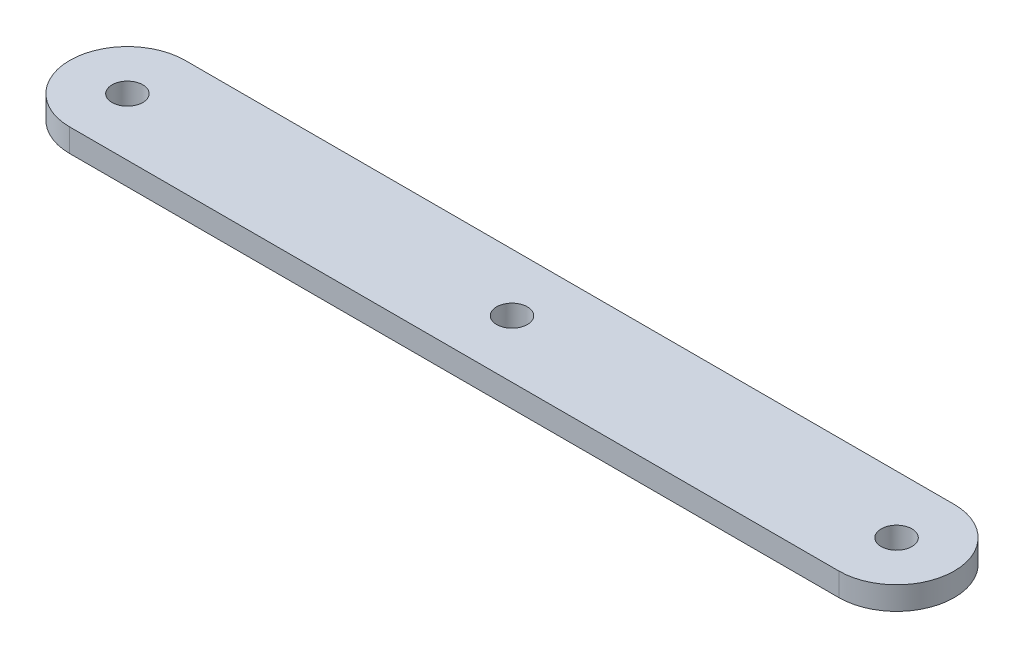
ISO-10303-21;
HEADER;
FILE_DESCRIPTION(('STEP AP214'),'2;1');
FILE_NAME('part.step','',(''),(''),'','','');
FILE_SCHEMA(('AUTOMOTIVE_DESIGN { 1 0 10303 214 1 1 1 1 }'));
ENDSEC;
DATA;
#1=APPLICATION_CONTEXT('core data for automotive mechanical design processes');
#2=APPLICATION_PROTOCOL_DEFINITION('international standard','automotive_design',2000,#1);
#3=PRODUCT_CONTEXT('',#1,'mechanical');
#4=PRODUCT('Part','Part','',(#3));
#5=PRODUCT_RELATED_PRODUCT_CATEGORY('part','',(#4));
#6=PRODUCT_DEFINITION_FORMATION('','',#4);
#7=PRODUCT_DEFINITION_CONTEXT('part definition',#1,'design');
#8=PRODUCT_DEFINITION('design','',#6,#7);
#9=PRODUCT_DEFINITION_SHAPE('','',#8);
#10=(LENGTH_UNIT() NAMED_UNIT(*) SI_UNIT(.MILLI.,.METRE.));
#11=(NAMED_UNIT(*) PLANE_ANGLE_UNIT() SI_UNIT($,.RADIAN.));
#12=(NAMED_UNIT(*) SI_UNIT($,.STERADIAN.) SOLID_ANGLE_UNIT());
#13=UNCERTAINTY_MEASURE_WITH_UNIT(LENGTH_MEASURE(1.E-05),#10,'distance_accuracy_value','');
#14=(GEOMETRIC_REPRESENTATION_CONTEXT(3) GLOBAL_UNCERTAINTY_ASSIGNED_CONTEXT((#13)) GLOBAL_UNIT_ASSIGNED_CONTEXT((#10,
#11,#12)) REPRESENTATION_CONTEXT('',''));
#15=CARTESIAN_POINT('',(0.,0.,0.));
#16=DIRECTION('',(0.,0.,1.));
#17=DIRECTION('',(1.,0.,0.));
#18=AXIS2_PLACEMENT_3D('',#15,#16,#17);
#19=CARTESIAN_POINT('',(-50.,3.,0.));
#20=DIRECTION('',(0.,-1.,0.));
#21=DIRECTION('',(0.,0.,-1.));
#22=AXIS2_PLACEMENT_3D('',#19,#20,#21);
#23=CYLINDRICAL_SURFACE('',#22,7.5);
#24=CARTESIAN_POINT('',(-50.,0.,0.));
#25=DIRECTION('',(0.,1.,0.));
#26=DIRECTION('',(0.,0.,-1.));
#27=AXIS2_PLACEMENT_3D('',#24,#25,#26);
#28=CIRCLE('',#27,7.5);
#29=CARTESIAN_POINT('',(-50.,0.,-7.49999999999999));
#30=VERTEX_POINT('',#29);
#31=CARTESIAN_POINT('',(-50.,0.,7.50000000000001));
#32=VERTEX_POINT('',#31);
#33=EDGE_CURVE('E99',#30,#32,#28,.T.);
#34=ORIENTED_EDGE('',*,*,#33,.T.);
#35=DIRECTION('',(0.,-1.,0.));
#36=VECTOR('',#35,1.);
#37=CARTESIAN_POINT('',(-50.,3.,7.50000000000001));
#38=LINE('',#37,#36);
#39=CARTESIAN_POINT('',(-50.,3.,7.50000000000001));
#40=VERTEX_POINT('',#39);
#41=EDGE_CURVE('E11',#40,#32,#38,.T.);
#42=ORIENTED_EDGE('',*,*,#41,.F.);
#43=CARTESIAN_POINT('',(-50.,3.,0.));
#44=DIRECTION('',(0.,1.,0.));
#45=DIRECTION('',(0.,0.,-1.));
#46=AXIS2_PLACEMENT_3D('',#43,#44,#45);
#47=CIRCLE('',#46,7.5);
#48=CARTESIAN_POINT('',(-50.,3.,-7.49999999999999));
#49=VERTEX_POINT('',#48);
#50=EDGE_CURVE('E86',#49,#40,#47,.T.);
#51=ORIENTED_EDGE('',*,*,#50,.F.);
#52=DIRECTION('',(0.,-1.,0.));
#53=VECTOR('',#52,1.);
#54=CARTESIAN_POINT('',(-50.,3.,-7.49999999999999));
#55=LINE('',#54,#53);
#56=EDGE_CURVE('E95',#49,#30,#55,.T.);
#57=ORIENTED_EDGE('',*,*,#56,.T.);
#58=EDGE_LOOP('',(#34,#42,#51,#57));
#59=FACE_BOUND('',#58,.T.);
#60=ADVANCED_FACE('F33',(#59),#23,.T.);
#61=CARTESIAN_POINT('',(50.,3.,7.49999999999999));
#62=DIRECTION('',(0.,0.,-1.));
#63=DIRECTION('',(-1.,0.,0.));
#64=AXIS2_PLACEMENT_3D('',#61,#62,#63);
#65=PLANE('',#64);
#66=DIRECTION('',(1.,0.,0.));
#67=VECTOR('',#66,1.);
#68=CARTESIAN_POINT('',(50.,0.,7.49999999999999));
#69=LINE('',#68,#67);
#70=CARTESIAN_POINT('',(50.,0.,7.49999999999999));
#71=VERTEX_POINT('',#70);
#72=EDGE_CURVE('E90',#32,#71,#69,.T.);
#73=ORIENTED_EDGE('',*,*,#72,.T.);
#74=DIRECTION('',(0.,-1.,0.));
#75=VECTOR('',#74,1.);
#76=CARTESIAN_POINT('',(50.,3.,7.49999999999999));
#77=LINE('',#76,#75);
#78=CARTESIAN_POINT('',(50.,3.,7.49999999999999));
#79=VERTEX_POINT('',#78);
#80=EDGE_CURVE('E42',#79,#71,#77,.T.);
#81=ORIENTED_EDGE('',*,*,#80,.F.);
#82=DIRECTION('',(1.,0.,0.));
#83=VECTOR('',#82,1.);
#84=CARTESIAN_POINT('',(50.,3.,7.49999999999999));
#85=LINE('',#84,#83);
#86=EDGE_CURVE('E81',#40,#79,#85,.T.);
#87=ORIENTED_EDGE('',*,*,#86,.F.);
#88=ORIENTED_EDGE('',*,*,#41,.T.);
#89=EDGE_LOOP('',(#73,#81,#87,#88));
#90=FACE_BOUND('',#89,.T.);
#91=ADVANCED_FACE('F89',(#90),#65,.F.);
#92=CARTESIAN_POINT('',(50.,3.,0.));
#93=DIRECTION('',(0.,-1.,0.));
#94=DIRECTION('',(0.,0.,-1.));
#95=AXIS2_PLACEMENT_3D('',#92,#93,#94);
#96=CYLINDRICAL_SURFACE('',#95,7.5);
#97=CARTESIAN_POINT('',(50.,0.,0.));
#98=DIRECTION('',(0.,1.,0.));
#99=DIRECTION('',(0.,0.,-1.));
#100=AXIS2_PLACEMENT_3D('',#97,#98,#99);
#101=CIRCLE('',#100,7.5);
#102=CARTESIAN_POINT('',(50.,0.,-7.50000000000001));
#103=VERTEX_POINT('',#102);
#104=EDGE_CURVE('E68',#71,#103,#101,.T.);
#105=ORIENTED_EDGE('',*,*,#104,.T.);
#106=DIRECTION('',(0.,-1.,0.));
#107=VECTOR('',#106,1.);
#108=CARTESIAN_POINT('',(50.,3.,-7.50000000000001));
#109=LINE('',#108,#107);
#110=CARTESIAN_POINT('',(50.,3.,-7.50000000000001));
#111=VERTEX_POINT('',#110);
#112=EDGE_CURVE('E91',#111,#103,#109,.T.);
#113=ORIENTED_EDGE('',*,*,#112,.F.);
#114=CARTESIAN_POINT('',(50.,3.,0.));
#115=DIRECTION('',(0.,1.,0.));
#116=DIRECTION('',(0.,0.,-1.));
#117=AXIS2_PLACEMENT_3D('',#114,#115,#116);
#118=CIRCLE('',#117,7.5);
#119=EDGE_CURVE('E84',#79,#111,#118,.T.);
#120=ORIENTED_EDGE('',*,*,#119,.F.);
#121=ORIENTED_EDGE('',*,*,#80,.T.);
#122=EDGE_LOOP('',(#105,#113,#120,#121));
#123=FACE_BOUND('',#122,.T.);
#124=ADVANCED_FACE('F93',(#123),#96,.T.);
#125=CARTESIAN_POINT('',(50.,3.,-7.50000000000001));
#126=DIRECTION('',(0.,0.,1.));
#127=DIRECTION('',(1.,0.,0.));
#128=AXIS2_PLACEMENT_3D('',#125,#126,#127);
#129=PLANE('',#128);
#130=DIRECTION('',(-1.,0.,0.));
#131=VECTOR('',#130,1.);
#132=CARTESIAN_POINT('',(50.,0.,-7.50000000000001));
#133=LINE('',#132,#131);
#134=EDGE_CURVE('E74',#103,#30,#133,.T.);
#135=ORIENTED_EDGE('',*,*,#134,.T.);
#136=ORIENTED_EDGE('',*,*,#56,.F.);
#137=DIRECTION('',(-1.,0.,0.));
#138=VECTOR('',#137,1.);
#139=CARTESIAN_POINT('',(50.,3.,-7.50000000000001));
#140=LINE('',#139,#138);
#141=EDGE_CURVE('E51',#111,#49,#140,.T.);
#142=ORIENTED_EDGE('',*,*,#141,.F.);
#143=ORIENTED_EDGE('',*,*,#112,.T.);
#144=EDGE_LOOP('',(#135,#136,#142,#143));
#145=FACE_BOUND('',#144,.T.);
#146=ADVANCED_FACE('F132',(#145),#129,.F.);
#147=CARTESIAN_POINT('',(-50.,3.,0.));
#148=DIRECTION('',(0.,-1.,0.));
#149=DIRECTION('',(0.,0.,-1.));
#150=AXIS2_PLACEMENT_3D('',#147,#148,#149);
#151=PLANE('',#150);
#152=CARTESIAN_POINT('',(0.,3.,0.));
#153=DIRECTION('',(0.,1.,0.));
#154=DIRECTION('',(0.,0.,1.));
#155=AXIS2_PLACEMENT_3D('',#152,#153,#154);
#156=CIRCLE('',#155,2.);
#157=CARTESIAN_POINT('',(0.,3.,2.));
#158=VERTEX_POINT('',#157);
#159=EDGE_CURVE('E122',#158,#158,#156,.T.);
#160=ORIENTED_EDGE('',*,*,#159,.F.);
#161=EDGE_LOOP('',(#160));
#162=FACE_BOUND('',#161,.T.);
#163=CARTESIAN_POINT('',(50.,3.,0.));
#164=DIRECTION('',(0.,1.,0.));
#165=DIRECTION('',(0.,0.,1.));
#166=AXIS2_PLACEMENT_3D('',#163,#164,#165);
#167=CIRCLE('',#166,2.);
#168=CARTESIAN_POINT('',(50.,3.,2.));
#169=VERTEX_POINT('',#168);
#170=EDGE_CURVE('E112',#169,#169,#167,.T.);
#171=ORIENTED_EDGE('',*,*,#170,.F.);
#172=EDGE_LOOP('',(#171));
#173=FACE_BOUND('',#172,.T.);
#174=CARTESIAN_POINT('',(-50.,3.,0.));
#175=DIRECTION('',(0.,1.,0.));
#176=DIRECTION('',(0.,0.,1.));
#177=AXIS2_PLACEMENT_3D('',#174,#175,#176);
#178=CIRCLE('',#177,2.);
#179=CARTESIAN_POINT('',(-50.,3.,2.00000000000001));
#180=VERTEX_POINT('',#179);
#181=EDGE_CURVE('E109',#180,#180,#178,.T.);
#182=ORIENTED_EDGE('',*,*,#181,.F.);
#183=EDGE_LOOP('',(#182));
#184=FACE_BOUND('',#183,.T.);
#185=ORIENTED_EDGE('',*,*,#50,.T.);
#186=ORIENTED_EDGE('',*,*,#86,.T.);
#187=ORIENTED_EDGE('',*,*,#119,.T.);
#188=ORIENTED_EDGE('',*,*,#141,.T.);
#189=EDGE_LOOP('',(#185,#186,#187,#188));
#190=FACE_BOUND('',#189,.T.);
#191=ADVANCED_FACE('F82',(#162,#173,#184,#190),#151,.F.);
#192=CARTESIAN_POINT('',(-50.,0.,0.));
#193=DIRECTION('',(0.,-1.,0.));
#194=DIRECTION('',(0.,0.,-1.));
#195=AXIS2_PLACEMENT_3D('',#192,#193,#194);
#196=PLANE('',#195);
#197=CARTESIAN_POINT('',(0.,0.,0.));
#198=DIRECTION('',(0.,-1.,0.));
#199=DIRECTION('',(0.,0.,-1.));
#200=AXIS2_PLACEMENT_3D('',#197,#198,#199);
#201=CIRCLE('',#200,2.);
#202=CARTESIAN_POINT('',(0.,0.,-2.));
#203=VERTEX_POINT('',#202);
#204=EDGE_CURVE('E36',#203,#203,#201,.T.);
#205=ORIENTED_EDGE('',*,*,#204,.F.);
#206=EDGE_LOOP('',(#205));
#207=FACE_BOUND('',#206,.T.);
#208=CARTESIAN_POINT('',(50.,0.,0.));
#209=DIRECTION('',(0.,-1.,0.));
#210=DIRECTION('',(0.,0.,-1.));
#211=AXIS2_PLACEMENT_3D('',#208,#209,#210);
#212=CIRCLE('',#211,2.);
#213=CARTESIAN_POINT('',(50.,0.,-2.00000000000001));
#214=VERTEX_POINT('',#213);
#215=EDGE_CURVE('E110',#214,#214,#212,.T.);
#216=ORIENTED_EDGE('',*,*,#215,.F.);
#217=EDGE_LOOP('',(#216));
#218=FACE_BOUND('',#217,.T.);
#219=CARTESIAN_POINT('',(-50.,0.,0.));
#220=DIRECTION('',(0.,-1.,0.));
#221=DIRECTION('',(0.,0.,-1.));
#222=AXIS2_PLACEMENT_3D('',#219,#220,#221);
#223=CIRCLE('',#222,2.);
#224=CARTESIAN_POINT('',(-50.,0.,-1.99999999999999));
#225=VERTEX_POINT('',#224);
#226=EDGE_CURVE('E102',#225,#225,#223,.T.);
#227=ORIENTED_EDGE('',*,*,#226,.F.);
#228=EDGE_LOOP('',(#227));
#229=FACE_BOUND('',#228,.T.);
#230=ORIENTED_EDGE('',*,*,#33,.F.);
#231=ORIENTED_EDGE('',*,*,#134,.F.);
#232=ORIENTED_EDGE('',*,*,#104,.F.);
#233=ORIENTED_EDGE('',*,*,#72,.F.);
#234=EDGE_LOOP('',(#230,#231,#232,#233));
#235=FACE_BOUND('',#234,.T.);
#236=ADVANCED_FACE('F131',(#207,#218,#229,#235),#196,.T.);
#237=CARTESIAN_POINT('',(-50.,-7.,0.));
#238=DIRECTION('',(0.,1.,0.));
#239=DIRECTION('',(0.,0.,1.));
#240=AXIS2_PLACEMENT_3D('',#237,#238,#239);
#241=CYLINDRICAL_SURFACE('',#240,2.);
#242=ORIENTED_EDGE('',*,*,#226,.T.);
#243=EDGE_LOOP('',(#242));
#244=FACE_BOUND('',#243,.T.);
#245=ORIENTED_EDGE('',*,*,#181,.T.);
#246=EDGE_LOOP('',(#245));
#247=FACE_BOUND('',#246,.T.);
#248=ADVANCED_FACE('F137',(#244,#247),#241,.F.);
#249=CARTESIAN_POINT('',(50.,-7.,0.));
#250=DIRECTION('',(0.,1.,0.));
#251=DIRECTION('',(0.,0.,1.));
#252=AXIS2_PLACEMENT_3D('',#249,#250,#251);
#253=CYLINDRICAL_SURFACE('',#252,2.);
#254=ORIENTED_EDGE('',*,*,#215,.T.);
#255=EDGE_LOOP('',(#254));
#256=FACE_BOUND('',#255,.T.);
#257=ORIENTED_EDGE('',*,*,#170,.T.);
#258=EDGE_LOOP('',(#257));
#259=FACE_BOUND('',#258,.T.);
#260=ADVANCED_FACE('F139',(#256,#259),#253,.F.);
#261=CARTESIAN_POINT('',(0.,-7.,0.));
#262=DIRECTION('',(0.,1.,0.));
#263=DIRECTION('',(0.,0.,1.));
#264=AXIS2_PLACEMENT_3D('',#261,#262,#263);
#265=CYLINDRICAL_SURFACE('',#264,2.);
#266=ORIENTED_EDGE('',*,*,#204,.T.);
#267=EDGE_LOOP('',(#266));
#268=FACE_BOUND('',#267,.T.);
#269=ORIENTED_EDGE('',*,*,#159,.T.);
#270=EDGE_LOOP('',(#269));
#271=FACE_BOUND('',#270,.T.);
#272=ADVANCED_FACE('F127',(#268,#271),#265,.F.);
#273=CLOSED_SHELL('',(#60,#91,#124,#146,#191,#236,#248,#260,#272));
#274=MANIFOLD_SOLID_BREP('B2',#273);
#275=ADVANCED_BREP_SHAPE_REPRESENTATION('',(#18,#274),#14);
#276=SHAPE_DEFINITION_REPRESENTATION(#9,#275);
ENDSEC;
END-ISO-10303-21;
